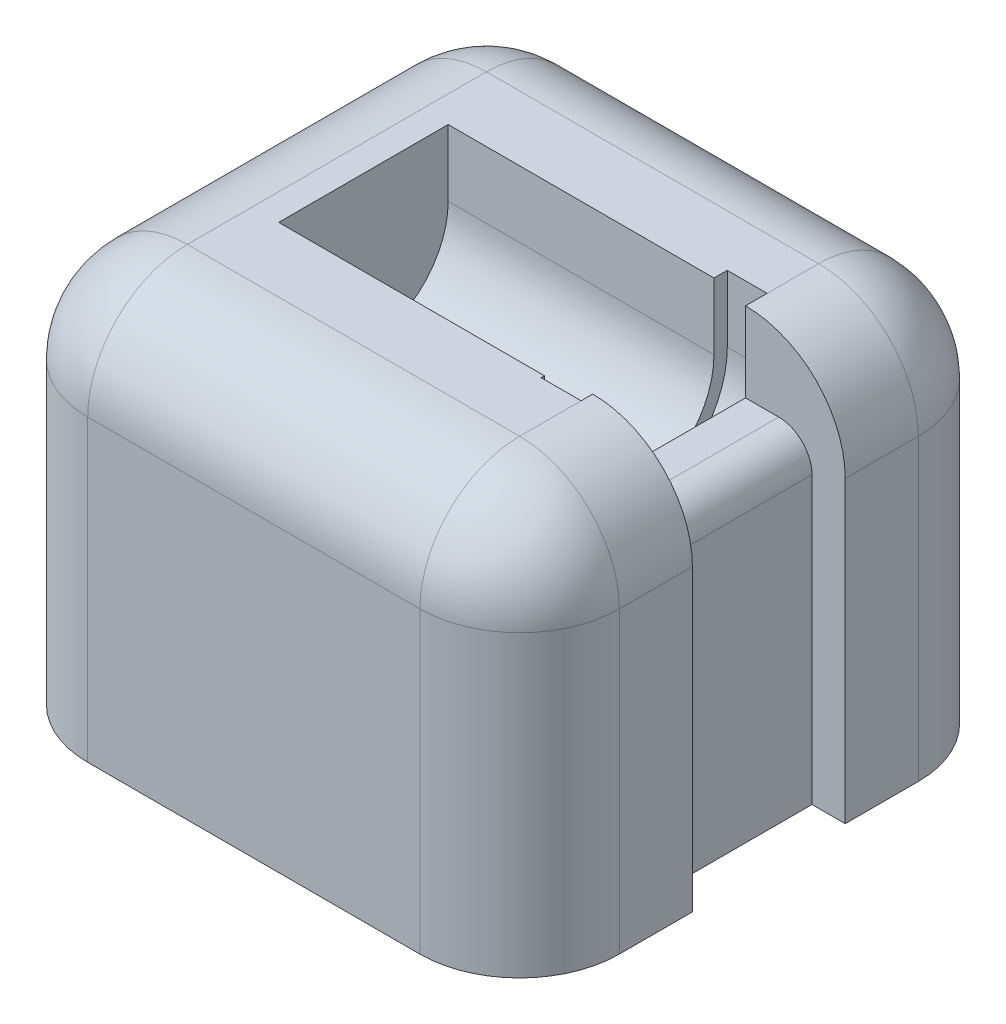
ISO-10303-21;
HEADER;
FILE_DESCRIPTION(('STEP AP214'),'2;1');
FILE_NAME('part.step','',(''),(''),'','','');
FILE_SCHEMA(('AUTOMOTIVE_DESIGN { 1 0 10303 214 1 1 1 1 }'));
ENDSEC;
DATA;
#1=APPLICATION_CONTEXT('core data for automotive mechanical design processes');
#2=APPLICATION_PROTOCOL_DEFINITION('international standard','automotive_design',2000,#1);
#3=PRODUCT_CONTEXT('',#1,'mechanical');
#4=PRODUCT('Part','Part','',(#3));
#5=PRODUCT_RELATED_PRODUCT_CATEGORY('part','',(#4));
#6=PRODUCT_DEFINITION_FORMATION('','',#4);
#7=PRODUCT_DEFINITION_CONTEXT('part definition',#1,'design');
#8=PRODUCT_DEFINITION('design','',#6,#7);
#9=PRODUCT_DEFINITION_SHAPE('','',#8);
#10=(LENGTH_UNIT() NAMED_UNIT(*) SI_UNIT(.MILLI.,.METRE.));
#11=(NAMED_UNIT(*) PLANE_ANGLE_UNIT() SI_UNIT($,.RADIAN.));
#12=(NAMED_UNIT(*) SI_UNIT($,.STERADIAN.) SOLID_ANGLE_UNIT());
#13=UNCERTAINTY_MEASURE_WITH_UNIT(LENGTH_MEASURE(1.E-05),#10,'distance_accuracy_value','');
#14=(GEOMETRIC_REPRESENTATION_CONTEXT(3) GLOBAL_UNCERTAINTY_ASSIGNED_CONTEXT((#13)) GLOBAL_UNIT_ASSIGNED_CONTEXT((#10,
#11,#12)) REPRESENTATION_CONTEXT('',''));
#15=CARTESIAN_POINT('',(0.,0.,0.));
#16=DIRECTION('',(0.,0.,1.));
#17=DIRECTION('',(1.,0.,0.));
#18=AXIS2_PLACEMENT_3D('',#15,#16,#17);
#19=CARTESIAN_POINT('',(7.5,12.,7.5));
#20=DIRECTION('',(-1.,0.,0.));
#21=DIRECTION('',(0.,0.,1.));
#22=AXIS2_PLACEMENT_3D('',#19,#20,#21);
#23=PLANE('',#22);
#24=DIRECTION('',(0.,-1.,0.));
#25=VECTOR('',#24,1.);
#26=CARTESIAN_POINT('',(7.5,12.,-2.3));
#27=LINE('',#26,#25);
#28=CARTESIAN_POINT('',(7.5,8.6,-2.3));
#29=VERTEX_POINT('',#28);
#30=CARTESIAN_POINT('',(7.5,0.,-2.3));
#31=VERTEX_POINT('',#30);
#32=EDGE_CURVE('E212',#29,#31,#27,.T.);
#33=ORIENTED_EDGE('',*,*,#32,.F.);
#34=DIRECTION('',(0.,0.,-1.));
#35=VECTOR('',#34,1.);
#36=CARTESIAN_POINT('',(7.5,8.6,7.5));
#37=LINE('',#36,#35);
#38=CARTESIAN_POINT('',(7.5,8.6,2.3));
#39=VERTEX_POINT('',#38);
#40=EDGE_CURVE('E329',#29,#39,#37,.F.);
#41=ORIENTED_EDGE('',*,*,#40,.T.);
#42=DIRECTION('',(0.,1.,0.));
#43=VECTOR('',#42,1.);
#44=CARTESIAN_POINT('',(7.5,0.,2.3));
#45=LINE('',#44,#43);
#46=CARTESIAN_POINT('',(7.5,0.,2.3));
#47=VERTEX_POINT('',#46);
#48=EDGE_CURVE('E221',#47,#39,#45,.T.);
#49=ORIENTED_EDGE('',*,*,#48,.F.);
#50=DIRECTION('',(0.,0.,-1.));
#51=VECTOR('',#50,1.);
#52=CARTESIAN_POINT('',(7.5,0.,7.5));
#53=LINE('',#52,#51);
#54=EDGE_CURVE('E321',#47,#31,#53,.T.);
#55=ORIENTED_EDGE('',*,*,#54,.T.);
#56=EDGE_LOOP('',(#33,#41,#49,#55));
#57=FACE_BOUND('',#56,.T.);
#58=ADVANCED_FACE('F35',(#57),#23,.F.);
#59=CARTESIAN_POINT('',(-7.5,12.,7.5));
#60=DIRECTION('',(1.,0.,0.));
#61=DIRECTION('',(0.,0.,-1.));
#62=AXIS2_PLACEMENT_3D('',#59,#60,#61);
#63=PLANE('',#62);
#64=DIRECTION('',(0.,0.,1.));
#65=VECTOR('',#64,1.);
#66=CARTESIAN_POINT('',(-7.5,9.,-7.5));
#67=LINE('',#66,#65);
#68=CARTESIAN_POINT('',(-7.5,9.,4.5));
#69=VERTEX_POINT('',#68);
#70=CARTESIAN_POINT('',(-7.5,9.,-4.5));
#71=VERTEX_POINT('',#70);
#72=EDGE_CURVE('E351',#69,#71,#67,.F.);
#73=ORIENTED_EDGE('',*,*,#72,.T.);
#74=DIRECTION('',(0.,-1.,0.));
#75=VECTOR('',#74,1.);
#76=CARTESIAN_POINT('',(-7.5,12.,-4.5));
#77=LINE('',#76,#75);
#78=CARTESIAN_POINT('',(-7.5,0.,-4.5));
#79=VERTEX_POINT('',#78);
#80=EDGE_CURVE('E353',#71,#79,#77,.T.);
#81=ORIENTED_EDGE('',*,*,#80,.T.);
#82=DIRECTION('',(0.,0.,1.));
#83=VECTOR('',#82,1.);
#84=CARTESIAN_POINT('',(-7.5,0.,7.5));
#85=LINE('',#84,#83);
#86=CARTESIAN_POINT('',(-7.5,0.,4.5));
#87=VERTEX_POINT('',#86);
#88=EDGE_CURVE('E313',#79,#87,#85,.T.);
#89=ORIENTED_EDGE('',*,*,#88,.T.);
#90=DIRECTION('',(0.,-1.,0.));
#91=VECTOR('',#90,1.);
#92=CARTESIAN_POINT('',(-7.5,12.,4.5));
#93=LINE('',#92,#91);
#94=EDGE_CURVE('E349',#87,#69,#93,.F.);
#95=ORIENTED_EDGE('',*,*,#94,.T.);
#96=EDGE_LOOP('',(#73,#81,#89,#95));
#97=FACE_BOUND('',#96,.T.);
#98=ADVANCED_FACE('F441',(#97),#63,.F.);
#99=CARTESIAN_POINT('',(7.5,12.,7.5));
#100=DIRECTION('',(0.,0.,-1.));
#101=DIRECTION('',(-1.,0.,0.));
#102=AXIS2_PLACEMENT_3D('',#99,#100,#101);
#103=PLANE('',#102);
#104=DIRECTION('',(1.,0.,0.));
#105=VECTOR('',#104,1.);
#106=CARTESIAN_POINT('',(-7.5,9.,7.5));
#107=LINE('',#106,#105);
#108=CARTESIAN_POINT('',(5.5,9.,7.5));
#109=VERTEX_POINT('',#108);
#110=CARTESIAN_POINT('',(-4.5,9.,7.5));
#111=VERTEX_POINT('',#110);
#112=EDGE_CURVE('E345',#109,#111,#107,.F.);
#113=ORIENTED_EDGE('',*,*,#112,.T.);
#114=DIRECTION('',(0.,-1.,0.));
#115=VECTOR('',#114,1.);
#116=CARTESIAN_POINT('',(-4.5,12.,7.5));
#117=LINE('',#116,#115);
#118=CARTESIAN_POINT('',(-4.5,0.,7.5));
#119=VERTEX_POINT('',#118);
#120=EDGE_CURVE('E347',#111,#119,#117,.T.);
#121=ORIENTED_EDGE('',*,*,#120,.T.);
#122=DIRECTION('',(1.,0.,0.));
#123=VECTOR('',#122,1.);
#124=CARTESIAN_POINT('',(7.5,0.,7.5));
#125=LINE('',#124,#123);
#126=CARTESIAN_POINT('',(5.5,0.,7.5));
#127=VERTEX_POINT('',#126);
#128=EDGE_CURVE('E318',#119,#127,#125,.T.);
#129=ORIENTED_EDGE('',*,*,#128,.T.);
#130=DIRECTION('',(0.,-1.,0.));
#131=VECTOR('',#130,1.);
#132=CARTESIAN_POINT('',(5.5,12.,7.5));
#133=LINE('',#132,#131);
#134=EDGE_CURVE('E342',#127,#109,#133,.F.);
#135=ORIENTED_EDGE('',*,*,#134,.T.);
#136=EDGE_LOOP('',(#113,#121,#129,#135));
#137=FACE_BOUND('',#136,.T.);
#138=ADVANCED_FACE('F447',(#137),#103,.F.);
#139=CARTESIAN_POINT('',(7.5,12.,-7.5));
#140=DIRECTION('',(0.,0.,1.));
#141=DIRECTION('',(1.,0.,0.));
#142=AXIS2_PLACEMENT_3D('',#139,#140,#141);
#143=PLANE('',#142);
#144=DIRECTION('',(-1.,0.,0.));
#145=VECTOR('',#144,1.);
#146=CARTESIAN_POINT('',(7.5,0.,-7.5));
#147=LINE('',#146,#145);
#148=CARTESIAN_POINT('',(5.5,0.,-7.5));
#149=VERTEX_POINT('',#148);
#150=CARTESIAN_POINT('',(-4.5,0.,-7.5));
#151=VERTEX_POINT('',#150);
#152=EDGE_CURVE('E323',#149,#151,#147,.T.);
#153=ORIENTED_EDGE('',*,*,#152,.T.);
#154=DIRECTION('',(0.,-1.,0.));
#155=VECTOR('',#154,1.);
#156=CARTESIAN_POINT('',(-4.5,12.,-7.5));
#157=LINE('',#156,#155);
#158=CARTESIAN_POINT('',(-4.5,9.,-7.5));
#159=VERTEX_POINT('',#158);
#160=EDGE_CURVE('E360',#151,#159,#157,.F.);
#161=ORIENTED_EDGE('',*,*,#160,.T.);
#162=DIRECTION('',(-1.,0.,0.));
#163=VECTOR('',#162,1.);
#164=CARTESIAN_POINT('',(8.5,9.,-7.5));
#165=LINE('',#164,#163);
#166=CARTESIAN_POINT('',(5.5,9.,-7.5));
#167=VERTEX_POINT('',#166);
#168=EDGE_CURVE('E357',#159,#167,#165,.F.);
#169=ORIENTED_EDGE('',*,*,#168,.T.);
#170=DIRECTION('',(0.,1.,0.));
#171=VECTOR('',#170,1.);
#172=CARTESIAN_POINT('',(5.5,0.,-7.5));
#173=LINE('',#172,#171);
#174=EDGE_CURVE('E355',#167,#149,#173,.F.);
#175=ORIENTED_EDGE('',*,*,#174,.T.);
#176=EDGE_LOOP('',(#153,#161,#169,#175));
#177=FACE_BOUND('',#176,.T.);
#178=ADVANCED_FACE('F424',(#177),#143,.F.);
#179=CARTESIAN_POINT('',(0.,12.,0.));
#180=DIRECTION('',(0.,1.,0.));
#181=DIRECTION('',(0.,0.,1.));
#182=AXIS2_PLACEMENT_3D('',#179,#180,#181);
#183=PLANE('',#182);
#184=DIRECTION('',(1.,0.,0.));
#185=VECTOR('',#184,1.);
#186=CARTESIAN_POINT('',(8.5,12.,4.5));
#187=LINE('',#186,#185);
#188=CARTESIAN_POINT('',(-4.5,12.,4.5));
#189=VERTEX_POINT('',#188);
#190=CARTESIAN_POINT('',(5.5,12.,4.5));
#191=VERTEX_POINT('',#190);
#192=EDGE_CURVE('E339',#189,#191,#187,.T.);
#193=ORIENTED_EDGE('',*,*,#192,.T.);
#194=DIRECTION('',(0.,0.,1.));
#195=VECTOR('',#194,1.);
#196=CARTESIAN_POINT('',(5.5,12.,0.));
#197=LINE('',#196,#195);
#198=CARTESIAN_POINT('',(5.5,12.,2.65));
#199=VERTEX_POINT('',#198);
#200=EDGE_CURVE('E396',#191,#199,#197,.F.);
#201=ORIENTED_EDGE('',*,*,#200,.T.);
#202=DIRECTION('',(1.,0.,0.));
#203=VECTOR('',#202,1.);
#204=CARTESIAN_POINT('',(4.3,12.,2.65));
#205=LINE('',#204,#203);
#206=CARTESIAN_POINT('',(4.3,12.,2.65));
#207=VERTEX_POINT('',#206);
#208=EDGE_CURVE('E293',#207,#199,#205,.T.);
#209=ORIENTED_EDGE('',*,*,#208,.F.);
#210=DIRECTION('',(0.,0.,1.));
#211=VECTOR('',#210,1.);
#212=CARTESIAN_POINT('',(4.3,12.,2.65));
#213=LINE('',#212,#211);
#214=CARTESIAN_POINT('',(4.3,12.,2.55));
#215=VERTEX_POINT('',#214);
#216=EDGE_CURVE('E279',#215,#207,#213,.T.);
#217=ORIENTED_EDGE('',*,*,#216,.F.);
#218=DIRECTION('',(1.,0.,0.));
#219=VECTOR('',#218,1.);
#220=CARTESIAN_POINT('',(-3.7,12.,2.55));
#221=LINE('',#220,#219);
#222=CARTESIAN_POINT('',(-3.7,12.,2.55));
#223=VERTEX_POINT('',#222);
#224=EDGE_CURVE('E263',#223,#215,#221,.T.);
#225=ORIENTED_EDGE('',*,*,#224,.F.);
#226=DIRECTION('',(0.,0.,1.));
#227=VECTOR('',#226,1.);
#228=CARTESIAN_POINT('',(-3.7,12.,2.55));
#229=LINE('',#228,#227);
#230=CARTESIAN_POINT('',(-3.7,12.,-2.55));
#231=VERTEX_POINT('',#230);
#232=EDGE_CURVE('E249',#231,#223,#229,.T.);
#233=ORIENTED_EDGE('',*,*,#232,.F.);
#234=DIRECTION('',(1.,0.,0.));
#235=VECTOR('',#234,1.);
#236=CARTESIAN_POINT('',(-3.7,12.,-2.55));
#237=LINE('',#236,#235);
#238=CARTESIAN_POINT('',(4.3,12.,-2.55));
#239=VERTEX_POINT('',#238);
#240=EDGE_CURVE('E265',#231,#239,#237,.T.);
#241=ORIENTED_EDGE('',*,*,#240,.T.);
#242=CARTESIAN_POINT('',(4.3,12.,-2.95));
#243=VERTEX_POINT('',#242);
#244=EDGE_CURVE('E280',#243,#239,#213,.T.);
#245=ORIENTED_EDGE('',*,*,#244,.F.);
#246=DIRECTION('',(1.,0.,0.));
#247=VECTOR('',#246,1.);
#248=CARTESIAN_POINT('',(4.3,12.,-2.95));
#249=LINE('',#248,#247);
#250=CARTESIAN_POINT('',(5.5,12.,-2.95));
#251=VERTEX_POINT('',#250);
#252=EDGE_CURVE('E297',#243,#251,#249,.T.);
#253=ORIENTED_EDGE('',*,*,#252,.T.);
#254=DIRECTION('',(0.,0.,1.));
#255=VECTOR('',#254,1.);
#256=CARTESIAN_POINT('',(5.5,12.,0.));
#257=LINE('',#256,#255);
#258=CARTESIAN_POINT('',(5.5,12.,-4.5));
#259=VERTEX_POINT('',#258);
#260=EDGE_CURVE('E394',#251,#259,#257,.F.);
#261=ORIENTED_EDGE('',*,*,#260,.T.);
#262=DIRECTION('',(-1.,0.,0.));
#263=VECTOR('',#262,1.);
#264=CARTESIAN_POINT('',(-7.5,12.,-4.5));
#265=LINE('',#264,#263);
#266=CARTESIAN_POINT('',(-4.5,12.,-4.5));
#267=VERTEX_POINT('',#266);
#268=EDGE_CURVE('E335',#259,#267,#265,.T.);
#269=ORIENTED_EDGE('',*,*,#268,.T.);
#270=DIRECTION('',(0.,0.,1.));
#271=VECTOR('',#270,1.);
#272=CARTESIAN_POINT('',(-4.5,12.,7.5));
#273=LINE('',#272,#271);
#274=EDGE_CURVE('E337',#267,#189,#273,.T.);
#275=ORIENTED_EDGE('',*,*,#274,.T.);
#276=EDGE_LOOP('',(#193,#201,#209,#217,#225,#233,#241,#245,#253,#261,#269,#275));
#277=FACE_BOUND('',#276,.T.);
#278=ADVANCED_FACE('F629',(#277),#183,.T.);
#279=CARTESIAN_POINT('',(0.,0.,0.));
#280=DIRECTION('',(0.,1.,0.));
#281=DIRECTION('',(0.,0.,1.));
#282=AXIS2_PLACEMENT_3D('',#279,#280,#281);
#283=PLANE('',#282);
#284=ORIENTED_EDGE('',*,*,#88,.F.);
#285=CARTESIAN_POINT('',(-4.5,0.,-4.5));
#286=DIRECTION('',(0.,1.,0.));
#287=DIRECTION('',(0.,0.,1.));
#288=AXIS2_PLACEMENT_3D('',#285,#286,#287);
#289=CIRCLE('',#288,3.);
#290=EDGE_CURVE('E367',#79,#151,#289,.F.);
#291=ORIENTED_EDGE('',*,*,#290,.T.);
#292=ORIENTED_EDGE('',*,*,#152,.F.);
#293=CARTESIAN_POINT('',(5.5,0.,-4.5));
#294=DIRECTION('',(0.,1.,0.));
#295=DIRECTION('',(0.,0.,1.));
#296=AXIS2_PLACEMENT_3D('',#293,#294,#295);
#297=CIRCLE('',#296,3.);
#298=CARTESIAN_POINT('',(8.5,0.,-4.5));
#299=VERTEX_POINT('',#298);
#300=EDGE_CURVE('E227',#149,#299,#297,.F.);
#301=ORIENTED_EDGE('',*,*,#300,.T.);
#302=DIRECTION('',(0.,0.,-1.));
#303=VECTOR('',#302,1.);
#304=CARTESIAN_POINT('',(8.5,0.,-2.3));
#305=LINE('',#304,#303);
#306=CARTESIAN_POINT('',(8.5,0.,-2.3));
#307=VERTEX_POINT('',#306);
#308=EDGE_CURVE('E209',#307,#299,#305,.T.);
#309=ORIENTED_EDGE('',*,*,#308,.F.);
#310=DIRECTION('',(-1.,0.,0.));
#311=VECTOR('',#310,1.);
#312=CARTESIAN_POINT('',(8.5,0.,-2.3));
#313=LINE('',#312,#311);
#314=EDGE_CURVE('E215',#307,#31,#313,.T.);
#315=ORIENTED_EDGE('',*,*,#314,.T.);
#316=ORIENTED_EDGE('',*,*,#54,.F.);
#317=DIRECTION('',(-1.,0.,0.));
#318=VECTOR('',#317,1.);
#319=CARTESIAN_POINT('',(8.5,0.,2.3));
#320=LINE('',#319,#318);
#321=CARTESIAN_POINT('',(8.5,0.,2.3));
#322=VERTEX_POINT('',#321);
#323=EDGE_CURVE('E237',#322,#47,#320,.T.);
#324=ORIENTED_EDGE('',*,*,#323,.F.);
#325=DIRECTION('',(0.,0.,-1.));
#326=VECTOR('',#325,1.);
#327=CARTESIAN_POINT('',(8.5,0.,7.5));
#328=LINE('',#327,#326);
#329=CARTESIAN_POINT('',(8.5,0.,4.5));
#330=VERTEX_POINT('',#329);
#331=EDGE_CURVE('E232',#330,#322,#328,.T.);
#332=ORIENTED_EDGE('',*,*,#331,.F.);
#333=CARTESIAN_POINT('',(5.5,0.,4.5));
#334=DIRECTION('',(0.,1.,0.));
#335=DIRECTION('',(0.,0.,1.));
#336=AXIS2_PLACEMENT_3D('',#333,#334,#335);
#337=CIRCLE('',#336,3.);
#338=EDGE_CURVE('E363',#330,#127,#337,.F.);
#339=ORIENTED_EDGE('',*,*,#338,.T.);
#340=ORIENTED_EDGE('',*,*,#128,.F.);
#341=CARTESIAN_POINT('',(-4.5,0.,4.5));
#342=DIRECTION('',(0.,1.,0.));
#343=DIRECTION('',(0.,0.,1.));
#344=AXIS2_PLACEMENT_3D('',#341,#342,#343);
#345=CIRCLE('',#344,3.);
#346=EDGE_CURVE('E365',#119,#87,#345,.F.);
#347=ORIENTED_EDGE('',*,*,#346,.T.);
#348=EDGE_LOOP('',(#284,#291,#292,#301,#309,#315,#316,#324,#332,#339,#340,#347));
#349=FACE_BOUND('',#348,.T.);
#350=ADVANCED_FACE('F224',(#349),#283,.F.);
#351=CARTESIAN_POINT('',(5.5,10.4,2.3));
#352=DIRECTION('',(0.,0.,1.));
#353=DIRECTION('',(1.,0.,0.));
#354=AXIS2_PLACEMENT_3D('',#351,#352,#353);
#355=PLANE('',#354);
#356=DIRECTION('',(0.,-1.,0.));
#357=VECTOR('',#356,1.);
#358=CARTESIAN_POINT('',(5.5,10.4,2.3));
#359=LINE('',#358,#357);
#360=CARTESIAN_POINT('',(5.5,12.,2.3));
#361=VERTEX_POINT('',#360);
#362=CARTESIAN_POINT('',(5.5,9.6,2.3));
#363=VERTEX_POINT('',#362);
#364=EDGE_CURVE('E296',#361,#363,#359,.T.);
#365=ORIENTED_EDGE('',*,*,#364,.F.);
#366=CARTESIAN_POINT('',(5.5,9.,2.3));
#367=DIRECTION('',(0.,0.,1.));
#368=DIRECTION('',(1.,0.,0.));
#369=AXIS2_PLACEMENT_3D('',#366,#367,#368);
#370=CIRCLE('',#369,3.);
#371=CARTESIAN_POINT('',(8.5,9.,2.3));
#372=VERTEX_POINT('',#371);
#373=EDGE_CURVE('E398',#361,#372,#370,.F.);
#374=ORIENTED_EDGE('',*,*,#373,.T.);
#375=DIRECTION('',(0.,1.,0.));
#376=VECTOR('',#375,1.);
#377=CARTESIAN_POINT('',(8.5,0.,2.3));
#378=LINE('',#377,#376);
#379=EDGE_CURVE('E234',#322,#372,#378,.T.);
#380=ORIENTED_EDGE('',*,*,#379,.F.);
#381=ORIENTED_EDGE('',*,*,#323,.T.);
#382=ORIENTED_EDGE('',*,*,#48,.T.);
#383=CARTESIAN_POINT('',(6.5,8.6,2.3));
#384=DIRECTION('',(0.,0.,1.));
#385=DIRECTION('',(1.,0.,0.));
#386=AXIS2_PLACEMENT_3D('',#383,#384,#385);
#387=CIRCLE('',#386,1.);
#388=CARTESIAN_POINT('',(6.5,9.6,2.3));
#389=VERTEX_POINT('',#388);
#390=EDGE_CURVE('E333',#39,#389,#387,.T.);
#391=ORIENTED_EDGE('',*,*,#390,.T.);
#392=DIRECTION('',(1.,0.,0.));
#393=VECTOR('',#392,1.);
#394=CARTESIAN_POINT('',(5.5,9.6,2.3));
#395=LINE('',#394,#393);
#396=EDGE_CURVE('E309',#363,#389,#395,.T.);
#397=ORIENTED_EDGE('',*,*,#396,.F.);
#398=EDGE_LOOP('',(#365,#374,#380,#381,#382,#391,#397));
#399=FACE_BOUND('',#398,.T.);
#400=ADVANCED_FACE('F604',(#399),#355,.F.);
#401=CARTESIAN_POINT('',(5.5,10.4,-2.3));
#402=DIRECTION('',(0.,0.,-1.));
#403=DIRECTION('',(0.,1.,0.));
#404=AXIS2_PLACEMENT_3D('',#401,#402,#403);
#405=PLANE('',#404);
#406=DIRECTION('',(0.,-1.,0.));
#407=VECTOR('',#406,1.);
#408=CARTESIAN_POINT('',(8.5,12.,-2.3));
#409=LINE('',#408,#407);
#410=CARTESIAN_POINT('',(8.5,9.,-2.3));
#411=VERTEX_POINT('',#410);
#412=EDGE_CURVE('E205',#411,#307,#409,.T.);
#413=ORIENTED_EDGE('',*,*,#412,.F.);
#414=CARTESIAN_POINT('',(5.5,9.,-2.3));
#415=DIRECTION('',(0.,0.,-1.));
#416=DIRECTION('',(0.,1.,0.));
#417=AXIS2_PLACEMENT_3D('',#414,#415,#416);
#418=CIRCLE('',#417,3.);
#419=CARTESIAN_POINT('',(5.5,12.,-2.3));
#420=VERTEX_POINT('',#419);
#421=EDGE_CURVE('E52',#411,#420,#418,.F.);
#422=ORIENTED_EDGE('',*,*,#421,.T.);
#423=DIRECTION('',(0.,1.,0.));
#424=VECTOR('',#423,1.);
#425=CARTESIAN_POINT('',(5.5,10.4,-2.3));
#426=LINE('',#425,#424);
#427=CARTESIAN_POINT('',(5.5,9.6,-2.3));
#428=VERTEX_POINT('',#427);
#429=EDGE_CURVE('E306',#428,#420,#426,.T.);
#430=ORIENTED_EDGE('',*,*,#429,.F.);
#431=DIRECTION('',(1.,0.,0.));
#432=VECTOR('',#431,1.);
#433=CARTESIAN_POINT('',(5.5,9.6,-2.3));
#434=LINE('',#433,#432);
#435=CARTESIAN_POINT('',(6.5,9.6,-2.3));
#436=VERTEX_POINT('',#435);
#437=EDGE_CURVE('E310',#428,#436,#434,.T.);
#438=ORIENTED_EDGE('',*,*,#437,.T.);
#439=CARTESIAN_POINT('',(6.5,8.6,-2.3));
#440=DIRECTION('',(0.,0.,-1.));
#441=DIRECTION('',(0.,1.,0.));
#442=AXIS2_PLACEMENT_3D('',#439,#440,#441);
#443=CIRCLE('',#442,1.);
#444=EDGE_CURVE('E331',#436,#29,#443,.T.);
#445=ORIENTED_EDGE('',*,*,#444,.T.);
#446=ORIENTED_EDGE('',*,*,#32,.T.);
#447=ORIENTED_EDGE('',*,*,#314,.F.);
#448=EDGE_LOOP('',(#413,#422,#430,#438,#445,#446,#447));
#449=FACE_BOUND('',#448,.T.);
#450=ADVANCED_FACE('F216',(#449),#405,.F.);
#451=CARTESIAN_POINT('',(5.5,9.6,-2.3));
#452=DIRECTION('',(0.,-1.,0.));
#453=DIRECTION('',(0.,0.,-1.));
#454=AXIS2_PLACEMENT_3D('',#451,#452,#453);
#455=PLANE('',#454);
#456=ORIENTED_EDGE('',*,*,#396,.T.);
#457=DIRECTION('',(0.,0.,-1.));
#458=VECTOR('',#457,1.);
#459=CARTESIAN_POINT('',(6.5,9.6,-2.3));
#460=LINE('',#459,#458);
#461=EDGE_CURVE('E326',#389,#436,#460,.T.);
#462=ORIENTED_EDGE('',*,*,#461,.T.);
#463=ORIENTED_EDGE('',*,*,#437,.F.);
#464=DIRECTION('',(0.,0.,-1.));
#465=VECTOR('',#464,1.);
#466=CARTESIAN_POINT('',(5.5,9.6,-2.3));
#467=LINE('',#466,#465);
#468=EDGE_CURVE('E304',#363,#428,#467,.T.);
#469=ORIENTED_EDGE('',*,*,#468,.F.);
#470=EDGE_LOOP('',(#456,#462,#463,#469));
#471=FACE_BOUND('',#470,.T.);
#472=ADVANCED_FACE('F603',(#471),#455,.F.);
#473=CARTESIAN_POINT('',(5.5,10.,0.));
#474=DIRECTION('',(1.,0.,0.));
#475=DIRECTION('',(0.,0.,-1.));
#476=AXIS2_PLACEMENT_3D('',#473,#474,#475);
#477=PLANE('',#476);
#478=ORIENTED_EDGE('',*,*,#468,.T.);
#479=ORIENTED_EDGE('',*,*,#429,.T.);
#480=DIRECTION('',(0.,0.,1.));
#481=VECTOR('',#480,1.);
#482=CARTESIAN_POINT('',(5.5,12.,2.65));
#483=LINE('',#482,#481);
#484=EDGE_CURVE('E273',#251,#420,#483,.T.);
#485=ORIENTED_EDGE('',*,*,#484,.F.);
#486=DIRECTION('',(0.,1.,0.));
#487=VECTOR('',#486,1.);
#488=CARTESIAN_POINT('',(5.5,12.,-2.95));
#489=LINE('',#488,#487);
#490=CARTESIAN_POINT('',(5.5,10.,-2.95));
#491=VERTEX_POINT('',#490);
#492=EDGE_CURVE('E289',#491,#251,#489,.T.);
#493=ORIENTED_EDGE('',*,*,#492,.F.);
#494=CARTESIAN_POINT('',(5.5,10.,0.));
#495=DIRECTION('',(1.,0.,0.));
#496=DIRECTION('',(0.,0.,-1.));
#497=AXIS2_PLACEMENT_3D('',#494,#495,#496);
#498=CIRCLE('',#497,2.95);
#499=CARTESIAN_POINT('',(5.5,8.70385186031842,2.65));
#500=VERTEX_POINT('',#499);
#501=EDGE_CURVE('E286',#500,#491,#498,.T.);
#502=ORIENTED_EDGE('',*,*,#501,.F.);
#503=DIRECTION('',(0.,-1.,0.));
#504=VECTOR('',#503,1.);
#505=CARTESIAN_POINT('',(5.5,11.2961481396816,2.65));
#506=LINE('',#505,#504);
#507=EDGE_CURVE('E262',#199,#500,#506,.T.);
#508=ORIENTED_EDGE('',*,*,#507,.F.);
#509=EDGE_CURVE('E291',#361,#199,#483,.T.);
#510=ORIENTED_EDGE('',*,*,#509,.F.);
#511=ORIENTED_EDGE('',*,*,#364,.T.);
#512=EDGE_LOOP('',(#478,#479,#485,#493,#502,#508,#510,#511));
#513=FACE_BOUND('',#512,.T.);
#514=ADVANCED_FACE('F741',(#513),#477,.F.);
#515=CARTESIAN_POINT('',(4.3,12.,-2.95));
#516=DIRECTION('',(0.,0.,-1.));
#517=DIRECTION('',(0.,1.,0.));
#518=AXIS2_PLACEMENT_3D('',#515,#516,#517);
#519=PLANE('',#518);
#520=ORIENTED_EDGE('',*,*,#492,.T.);
#521=ORIENTED_EDGE('',*,*,#252,.F.);
#522=DIRECTION('',(0.,1.,0.));
#523=VECTOR('',#522,1.);
#524=CARTESIAN_POINT('',(4.3,12.,-2.95));
#525=LINE('',#524,#523);
#526=CARTESIAN_POINT('',(4.3,10.,-2.95));
#527=VERTEX_POINT('',#526);
#528=EDGE_CURVE('E276',#527,#243,#525,.T.);
#529=ORIENTED_EDGE('',*,*,#528,.F.);
#530=DIRECTION('',(1.,0.,0.));
#531=VECTOR('',#530,1.);
#532=CARTESIAN_POINT('',(4.3,10.,-2.95));
#533=LINE('',#532,#531);
#534=EDGE_CURVE('E300',#527,#491,#533,.T.);
#535=ORIENTED_EDGE('',*,*,#534,.T.);
#536=EDGE_LOOP('',(#520,#521,#529,#535));
#537=FACE_BOUND('',#536,.T.);
#538=ADVANCED_FACE('F737',(#537),#519,.F.);
#539=CARTESIAN_POINT('',(4.3,10.,0.));
#540=DIRECTION('',(1.,0.,0.));
#541=DIRECTION('',(0.,0.,-1.));
#542=AXIS2_PLACEMENT_3D('',#539,#540,#541);
#543=CYLINDRICAL_SURFACE('',#542,2.95);
#544=ORIENTED_EDGE('',*,*,#501,.T.);
#545=ORIENTED_EDGE('',*,*,#534,.F.);
#546=CARTESIAN_POINT('',(4.3,10.,0.));
#547=DIRECTION('',(1.,0.,0.));
#548=DIRECTION('',(0.,0.,-1.));
#549=AXIS2_PLACEMENT_3D('',#546,#547,#548);
#550=CIRCLE('',#549,2.95);
#551=CARTESIAN_POINT('',(4.3,8.70385186031842,2.65));
#552=VERTEX_POINT('',#551);
#553=EDGE_CURVE('E272',#552,#527,#550,.T.);
#554=ORIENTED_EDGE('',*,*,#553,.F.);
#555=DIRECTION('',(1.,0.,0.));
#556=VECTOR('',#555,1.);
#557=CARTESIAN_POINT('',(4.3,8.70385186031842,2.65));
#558=LINE('',#557,#556);
#559=EDGE_CURVE('E283',#552,#500,#558,.T.);
#560=ORIENTED_EDGE('',*,*,#559,.T.);
#561=EDGE_LOOP('',(#544,#545,#554,#560));
#562=FACE_BOUND('',#561,.T.);
#563=ADVANCED_FACE('F727',(#562),#543,.F.);
#564=CARTESIAN_POINT('',(4.3,11.2961481396816,2.65));
#565=DIRECTION('',(0.,0.,1.));
#566=DIRECTION('',(1.,0.,0.));
#567=AXIS2_PLACEMENT_3D('',#564,#565,#566);
#568=PLANE('',#567);
#569=ORIENTED_EDGE('',*,*,#507,.T.);
#570=ORIENTED_EDGE('',*,*,#559,.F.);
#571=DIRECTION('',(0.,-1.,0.));
#572=VECTOR('',#571,1.);
#573=CARTESIAN_POINT('',(4.3,11.2961481396816,2.65));
#574=LINE('',#573,#572);
#575=EDGE_CURVE('E270',#207,#552,#574,.T.);
#576=ORIENTED_EDGE('',*,*,#575,.F.);
#577=ORIENTED_EDGE('',*,*,#208,.T.);
#578=EDGE_LOOP('',(#569,#570,#576,#577));
#579=FACE_BOUND('',#578,.T.);
#580=ADVANCED_FACE('F718',(#579),#568,.F.);
#581=CARTESIAN_POINT('',(4.3,10.,0.));
#582=DIRECTION('',(1.,0.,0.));
#583=DIRECTION('',(0.,0.,-1.));
#584=AXIS2_PLACEMENT_3D('',#581,#582,#583);
#585=PLANE('',#584);
#586=DIRECTION('',(0.,-1.,0.));
#587=VECTOR('',#586,1.);
#588=CARTESIAN_POINT('',(4.3,10.,2.55));
#589=LINE('',#588,#587);
#590=CARTESIAN_POINT('',(4.3,10.,2.55));
#591=VERTEX_POINT('',#590);
#592=EDGE_CURVE('E246',#215,#591,#589,.T.);
#593=ORIENTED_EDGE('',*,*,#592,.F.);
#594=ORIENTED_EDGE('',*,*,#216,.T.);
#595=ORIENTED_EDGE('',*,*,#575,.T.);
#596=ORIENTED_EDGE('',*,*,#553,.T.);
#597=ORIENTED_EDGE('',*,*,#528,.T.);
#598=ORIENTED_EDGE('',*,*,#244,.T.);
#599=DIRECTION('',(0.,1.,0.));
#600=VECTOR('',#599,1.);
#601=CARTESIAN_POINT('',(4.3,12.,-2.55));
#602=LINE('',#601,#600);
#603=CARTESIAN_POINT('',(4.3,10.,-2.55));
#604=VERTEX_POINT('',#603);
#605=EDGE_CURVE('E256',#604,#239,#602,.T.);
#606=ORIENTED_EDGE('',*,*,#605,.F.);
#607=CARTESIAN_POINT('',(4.3,10.,0.));
#608=DIRECTION('',(1.,0.,0.));
#609=DIRECTION('',(0.,0.,-1.));
#610=AXIS2_PLACEMENT_3D('',#607,#608,#609);
#611=CIRCLE('',#610,2.55);
#612=EDGE_CURVE('E241',#591,#604,#611,.T.);
#613=ORIENTED_EDGE('',*,*,#612,.F.);
#614=EDGE_LOOP('',(#593,#594,#595,#596,#597,#598,#606,#613));
#615=FACE_BOUND('',#614,.T.);
#616=ADVANCED_FACE('F709',(#615),#585,.T.);
#617=CARTESIAN_POINT('',(-3.7,10.,0.));
#618=DIRECTION('',(1.,0.,0.));
#619=DIRECTION('',(0.,0.,-1.));
#620=AXIS2_PLACEMENT_3D('',#617,#618,#619);
#621=CYLINDRICAL_SURFACE('',#620,2.55);
#622=ORIENTED_EDGE('',*,*,#612,.T.);
#623=DIRECTION('',(1.,0.,0.));
#624=VECTOR('',#623,1.);
#625=CARTESIAN_POINT('',(-3.7,10.,-2.55));
#626=LINE('',#625,#624);
#627=CARTESIAN_POINT('',(-3.7,10.,-2.55));
#628=VERTEX_POINT('',#627);
#629=EDGE_CURVE('E254',#628,#604,#626,.T.);
#630=ORIENTED_EDGE('',*,*,#629,.F.);
#631=CARTESIAN_POINT('',(-3.7,10.,0.));
#632=DIRECTION('',(1.,0.,0.));
#633=DIRECTION('',(0.,0.,-1.));
#634=AXIS2_PLACEMENT_3D('',#631,#632,#633);
#635=CIRCLE('',#634,2.55);
#636=CARTESIAN_POINT('',(-3.7,10.,2.55));
#637=VERTEX_POINT('',#636);
#638=EDGE_CURVE('E242',#637,#628,#635,.T.);
#639=ORIENTED_EDGE('',*,*,#638,.F.);
#640=DIRECTION('',(1.,0.,0.));
#641=VECTOR('',#640,1.);
#642=CARTESIAN_POINT('',(-3.7,10.,2.55));
#643=LINE('',#642,#641);
#644=EDGE_CURVE('E260',#637,#591,#643,.T.);
#645=ORIENTED_EDGE('',*,*,#644,.T.);
#646=EDGE_LOOP('',(#622,#630,#639,#645));
#647=FACE_BOUND('',#646,.T.);
#648=ADVANCED_FACE('F700',(#647),#621,.F.);
#649=CARTESIAN_POINT('',(-3.7,10.,2.55));
#650=DIRECTION('',(0.,0.,1.));
#651=DIRECTION('',(0.,-1.,0.));
#652=AXIS2_PLACEMENT_3D('',#649,#650,#651);
#653=PLANE('',#652);
#654=ORIENTED_EDGE('',*,*,#592,.T.);
#655=ORIENTED_EDGE('',*,*,#644,.F.);
#656=DIRECTION('',(0.,-1.,0.));
#657=VECTOR('',#656,1.);
#658=CARTESIAN_POINT('',(-3.7,10.,2.55));
#659=LINE('',#658,#657);
#660=EDGE_CURVE('E251',#223,#637,#659,.T.);
#661=ORIENTED_EDGE('',*,*,#660,.F.);
#662=ORIENTED_EDGE('',*,*,#224,.T.);
#663=EDGE_LOOP('',(#654,#655,#661,#662));
#664=FACE_BOUND('',#663,.T.);
#665=ADVANCED_FACE('F691',(#664),#653,.F.);
#666=CARTESIAN_POINT('',(-3.7,12.,-2.55));
#667=DIRECTION('',(0.,0.,-1.));
#668=DIRECTION('',(-1.,0.,0.));
#669=AXIS2_PLACEMENT_3D('',#666,#667,#668);
#670=PLANE('',#669);
#671=ORIENTED_EDGE('',*,*,#605,.T.);
#672=ORIENTED_EDGE('',*,*,#240,.F.);
#673=DIRECTION('',(0.,1.,0.));
#674=VECTOR('',#673,1.);
#675=CARTESIAN_POINT('',(-3.7,12.,-2.55));
#676=LINE('',#675,#674);
#677=EDGE_CURVE('E245',#628,#231,#676,.T.);
#678=ORIENTED_EDGE('',*,*,#677,.F.);
#679=ORIENTED_EDGE('',*,*,#629,.T.);
#680=EDGE_LOOP('',(#671,#672,#678,#679));
#681=FACE_BOUND('',#680,.T.);
#682=ADVANCED_FACE('F682',(#681),#670,.F.);
#683=CARTESIAN_POINT('',(-3.7,10.,0.));
#684=DIRECTION('',(1.,0.,0.));
#685=DIRECTION('',(0.,0.,-1.));
#686=AXIS2_PLACEMENT_3D('',#683,#684,#685);
#687=PLANE('',#686);
#688=ORIENTED_EDGE('',*,*,#638,.T.);
#689=ORIENTED_EDGE('',*,*,#677,.T.);
#690=ORIENTED_EDGE('',*,*,#232,.T.);
#691=ORIENTED_EDGE('',*,*,#660,.T.);
#692=EDGE_LOOP('',(#688,#689,#690,#691));
#693=FACE_BOUND('',#692,.T.);
#694=ADVANCED_FACE('F592',(#693),#687,.T.);
#695=CARTESIAN_POINT('',(8.5,0.,0.));
#696=DIRECTION('',(1.,0.,0.));
#697=DIRECTION('',(0.,0.,-1.));
#698=AXIS2_PLACEMENT_3D('',#695,#696,#697);
#699=PLANE('',#698);
#700=ORIENTED_EDGE('',*,*,#379,.T.);
#701=DIRECTION('',(0.,0.,1.));
#702=VECTOR('',#701,1.);
#703=CARTESIAN_POINT('',(8.5,9.,0.));
#704=LINE('',#703,#702);
#705=CARTESIAN_POINT('',(8.5,9.,4.5));
#706=VERTEX_POINT('',#705);
#707=EDGE_CURVE('E373',#372,#706,#704,.T.);
#708=ORIENTED_EDGE('',*,*,#707,.T.);
#709=DIRECTION('',(0.,-1.,0.));
#710=VECTOR('',#709,1.);
#711=CARTESIAN_POINT('',(8.5,0.,4.5));
#712=LINE('',#711,#710);
#713=EDGE_CURVE('E369',#706,#330,#712,.T.);
#714=ORIENTED_EDGE('',*,*,#713,.T.);
#715=ORIENTED_EDGE('',*,*,#331,.T.);
#716=EDGE_LOOP('',(#700,#708,#714,#715));
#717=FACE_BOUND('',#716,.T.);
#718=ADVANCED_FACE('F584',(#717),#699,.T.);
#719=CARTESIAN_POINT('',(8.5,0.,0.));
#720=DIRECTION('',(1.,0.,0.));
#721=DIRECTION('',(0.,0.,-1.));
#722=AXIS2_PLACEMENT_3D('',#719,#720,#721);
#723=PLANE('',#722);
#724=DIRECTION('',(0.,1.,0.));
#725=VECTOR('',#724,1.);
#726=CARTESIAN_POINT('',(8.5,12.,-4.5));
#727=LINE('',#726,#725);
#728=CARTESIAN_POINT('',(8.5,9.,-4.5));
#729=VERTEX_POINT('',#728);
#730=EDGE_CURVE('E371',#299,#729,#727,.T.);
#731=ORIENTED_EDGE('',*,*,#730,.T.);
#732=DIRECTION('',(0.,0.,1.));
#733=VECTOR('',#732,1.);
#734=CARTESIAN_POINT('',(8.5,9.,0.));
#735=LINE('',#734,#733);
#736=EDGE_CURVE('E210',#729,#411,#735,.T.);
#737=ORIENTED_EDGE('',*,*,#736,.T.);
#738=ORIENTED_EDGE('',*,*,#412,.T.);
#739=ORIENTED_EDGE('',*,*,#308,.T.);
#740=EDGE_LOOP('',(#731,#737,#738,#739));
#741=FACE_BOUND('',#740,.T.);
#742=ADVANCED_FACE('F207',(#741),#723,.T.);
#743=CARTESIAN_POINT('',(6.5,8.6,-2.3));
#744=DIRECTION('',(0.,0.,-1.));
#745=DIRECTION('',(-1.,0.,0.));
#746=AXIS2_PLACEMENT_3D('',#743,#744,#745);
#747=CYLINDRICAL_SURFACE('',#746,1.);
#748=ORIENTED_EDGE('',*,*,#390,.F.);
#749=ORIENTED_EDGE('',*,*,#40,.F.);
#750=ORIENTED_EDGE('',*,*,#444,.F.);
#751=ORIENTED_EDGE('',*,*,#461,.F.);
#752=EDGE_LOOP('',(#748,#749,#750,#751));
#753=FACE_BOUND('',#752,.T.);
#754=ADVANCED_FACE('F429',(#753),#747,.T.);
#755=CARTESIAN_POINT('',(5.5,0.,-4.5));
#756=DIRECTION('',(0.,-1.,0.));
#757=DIRECTION('',(0.,0.,-1.));
#758=AXIS2_PLACEMENT_3D('',#755,#756,#757);
#759=CYLINDRICAL_SURFACE('',#758,3.);
#760=ORIENTED_EDGE('',*,*,#174,.F.);
#761=CARTESIAN_POINT('',(5.5,9.,-4.5));
#762=DIRECTION('',(0.,-1.,0.));
#763=DIRECTION('',(0.,0.,-1.));
#764=AXIS2_PLACEMENT_3D('',#761,#762,#763);
#765=CIRCLE('',#764,3.);
#766=EDGE_CURVE('E11',#167,#729,#765,.T.);
#767=ORIENTED_EDGE('',*,*,#766,.T.);
#768=ORIENTED_EDGE('',*,*,#730,.F.);
#769=ORIENTED_EDGE('',*,*,#300,.F.);
#770=EDGE_LOOP('',(#760,#767,#768,#769));
#771=FACE_BOUND('',#770,.T.);
#772=ADVANCED_FACE('F426',(#771),#759,.T.);
#773=CARTESIAN_POINT('',(-4.5,12.,-4.5));
#774=DIRECTION('',(0.,-1.,0.));
#775=DIRECTION('',(0.,0.,-1.));
#776=AXIS2_PLACEMENT_3D('',#773,#774,#775);
#777=CYLINDRICAL_SURFACE('',#776,3.);
#778=ORIENTED_EDGE('',*,*,#290,.F.);
#779=ORIENTED_EDGE('',*,*,#80,.F.);
#780=CARTESIAN_POINT('',(-4.5,9.,-4.5));
#781=DIRECTION('',(0.,1.,0.));
#782=DIRECTION('',(0.,0.,1.));
#783=AXIS2_PLACEMENT_3D('',#780,#781,#782);
#784=CIRCLE('',#783,3.);
#785=EDGE_CURVE('E230',#159,#71,#784,.T.);
#786=ORIENTED_EDGE('',*,*,#785,.F.);
#787=ORIENTED_EDGE('',*,*,#160,.F.);
#788=EDGE_LOOP('',(#778,#779,#786,#787));
#789=FACE_BOUND('',#788,.T.);
#790=ADVANCED_FACE('F428',(#789),#777,.T.);
#791=CARTESIAN_POINT('',(0.,9.,-4.5));
#792=DIRECTION('',(1.,0.,0.));
#793=DIRECTION('',(0.,0.,-1.));
#794=AXIS2_PLACEMENT_3D('',#791,#792,#793);
#795=CYLINDRICAL_SURFACE('',#794,3.);
#796=ORIENTED_EDGE('',*,*,#268,.F.);
#797=CARTESIAN_POINT('',(5.5,9.,-4.5));
#798=DIRECTION('',(1.,0.,0.));
#799=DIRECTION('',(0.,0.,-1.));
#800=AXIS2_PLACEMENT_3D('',#797,#798,#799);
#801=CIRCLE('',#800,3.);
#802=EDGE_CURVE('E44',#259,#167,#801,.F.);
#803=ORIENTED_EDGE('',*,*,#802,.T.);
#804=ORIENTED_EDGE('',*,*,#168,.F.);
#805=CARTESIAN_POINT('',(-4.5,9.,-4.5));
#806=DIRECTION('',(-1.,0.,0.));
#807=DIRECTION('',(0.,0.,1.));
#808=AXIS2_PLACEMENT_3D('',#805,#806,#807);
#809=CIRCLE('',#808,3.);
#810=EDGE_CURVE('E387',#267,#159,#809,.T.);
#811=ORIENTED_EDGE('',*,*,#810,.F.);
#812=EDGE_LOOP('',(#796,#803,#804,#811));
#813=FACE_BOUND('',#812,.T.);
#814=ADVANCED_FACE('F420',(#813),#795,.T.);
#815=CARTESIAN_POINT('',(-4.5,9.,-4.5));
#816=DIRECTION('',(0.,0.,1.));
#817=DIRECTION('',(1.,0.,0.));
#818=AXIS2_PLACEMENT_3D('',#815,#816,#817);
#819=SPHERICAL_SURFACE('',#818,3.);
#820=ORIENTED_EDGE('',*,*,#810,.T.);
#821=ORIENTED_EDGE('',*,*,#785,.T.);
#822=CARTESIAN_POINT('',(-4.5,9.,-4.5));
#823=DIRECTION('',(0.,0.,-1.));
#824=DIRECTION('',(0.,1.,0.));
#825=AXIS2_PLACEMENT_3D('',#822,#823,#824);
#826=CIRCLE('',#825,3.);
#827=EDGE_CURVE('E384',#267,#71,#826,.F.);
#828=ORIENTED_EDGE('',*,*,#827,.F.);
#829=EDGE_LOOP('',(#820,#821,#828));
#830=FACE_BOUND('',#829,.T.);
#831=ADVANCED_FACE('F476',(#830),#819,.T.);
#832=CARTESIAN_POINT('',(-4.5,12.,4.5));
#833=DIRECTION('',(0.,-1.,0.));
#834=DIRECTION('',(0.,0.,-1.));
#835=AXIS2_PLACEMENT_3D('',#832,#833,#834);
#836=CYLINDRICAL_SURFACE('',#835,3.);
#837=ORIENTED_EDGE('',*,*,#346,.F.);
#838=ORIENTED_EDGE('',*,*,#120,.F.);
#839=CARTESIAN_POINT('',(-4.5,9.,4.5));
#840=DIRECTION('',(0.,1.,0.));
#841=DIRECTION('',(0.,0.,1.));
#842=AXIS2_PLACEMENT_3D('',#839,#840,#841);
#843=CIRCLE('',#842,3.);
#844=EDGE_CURVE('E381',#69,#111,#843,.T.);
#845=ORIENTED_EDGE('',*,*,#844,.F.);
#846=ORIENTED_EDGE('',*,*,#94,.F.);
#847=EDGE_LOOP('',(#837,#838,#845,#846));
#848=FACE_BOUND('',#847,.T.);
#849=ADVANCED_FACE('F472',(#848),#836,.T.);
#850=CARTESIAN_POINT('',(-4.5,9.,0.));
#851=DIRECTION('',(0.,0.,-1.));
#852=DIRECTION('',(-1.,0.,0.));
#853=AXIS2_PLACEMENT_3D('',#850,#851,#852);
#854=CYLINDRICAL_SURFACE('',#853,3.);
#855=ORIENTED_EDGE('',*,*,#827,.T.);
#856=ORIENTED_EDGE('',*,*,#72,.F.);
#857=CARTESIAN_POINT('',(-4.5,9.,4.5));
#858=DIRECTION('',(0.,0.,1.));
#859=DIRECTION('',(1.,0.,0.));
#860=AXIS2_PLACEMENT_3D('',#857,#858,#859);
#861=CIRCLE('',#860,3.);
#862=EDGE_CURVE('E377',#189,#69,#861,.T.);
#863=ORIENTED_EDGE('',*,*,#862,.F.);
#864=ORIENTED_EDGE('',*,*,#274,.F.);
#865=EDGE_LOOP('',(#855,#856,#863,#864));
#866=FACE_BOUND('',#865,.T.);
#867=ADVANCED_FACE('F468',(#866),#854,.T.);
#868=CARTESIAN_POINT('',(-4.5,9.,4.5));
#869=DIRECTION('',(0.,0.,1.));
#870=DIRECTION('',(1.,0.,0.));
#871=AXIS2_PLACEMENT_3D('',#868,#869,#870);
#872=SPHERICAL_SURFACE('',#871,3.);
#873=ORIENTED_EDGE('',*,*,#862,.T.);
#874=ORIENTED_EDGE('',*,*,#844,.T.);
#875=CARTESIAN_POINT('',(-4.5,9.,4.5));
#876=DIRECTION('',(-1.,0.,0.));
#877=DIRECTION('',(0.,-1.,0.));
#878=AXIS2_PLACEMENT_3D('',#875,#876,#877);
#879=CIRCLE('',#878,3.);
#880=EDGE_CURVE('E374',#189,#111,#879,.F.);
#881=ORIENTED_EDGE('',*,*,#880,.F.);
#882=EDGE_LOOP('',(#873,#874,#881));
#883=FACE_BOUND('',#882,.T.);
#884=ADVANCED_FACE('F464',(#883),#872,.T.);
#885=CARTESIAN_POINT('',(5.5,0.,4.5));
#886=DIRECTION('',(0.,1.,0.));
#887=DIRECTION('',(0.,0.,1.));
#888=AXIS2_PLACEMENT_3D('',#885,#886,#887);
#889=CYLINDRICAL_SURFACE('',#888,3.);
#890=ORIENTED_EDGE('',*,*,#713,.F.);
#891=CARTESIAN_POINT('',(5.5,9.,4.5));
#892=DIRECTION('',(0.,1.,0.));
#893=DIRECTION('',(0.,0.,1.));
#894=AXIS2_PLACEMENT_3D('',#891,#892,#893);
#895=CIRCLE('',#894,3.);
#896=EDGE_CURVE('E404',#706,#109,#895,.F.);
#897=ORIENTED_EDGE('',*,*,#896,.T.);
#898=ORIENTED_EDGE('',*,*,#134,.F.);
#899=ORIENTED_EDGE('',*,*,#338,.F.);
#900=EDGE_LOOP('',(#890,#897,#898,#899));
#901=FACE_BOUND('',#900,.T.);
#902=ADVANCED_FACE('F460',(#901),#889,.T.);
#903=CARTESIAN_POINT('',(0.,9.,4.5));
#904=DIRECTION('',(-1.,0.,0.));
#905=DIRECTION('',(0.,0.,1.));
#906=AXIS2_PLACEMENT_3D('',#903,#904,#905);
#907=CYLINDRICAL_SURFACE('',#906,3.);
#908=ORIENTED_EDGE('',*,*,#112,.F.);
#909=CARTESIAN_POINT('',(5.5,9.,4.5));
#910=DIRECTION('',(-1.,0.,0.));
#911=DIRECTION('',(0.,0.,1.));
#912=AXIS2_PLACEMENT_3D('',#909,#910,#911);
#913=CIRCLE('',#912,3.);
#914=EDGE_CURVE('E402',#109,#191,#913,.T.);
#915=ORIENTED_EDGE('',*,*,#914,.T.);
#916=ORIENTED_EDGE('',*,*,#192,.F.);
#917=ORIENTED_EDGE('',*,*,#880,.T.);
#918=EDGE_LOOP('',(#908,#915,#916,#917));
#919=FACE_BOUND('',#918,.T.);
#920=ADVANCED_FACE('F456',(#919),#907,.T.);
#921=CARTESIAN_POINT('',(5.5,9.,4.5));
#922=DIRECTION('',(0.,0.,1.));
#923=DIRECTION('',(1.,0.,0.));
#924=AXIS2_PLACEMENT_3D('',#921,#922,#923);
#925=SPHERICAL_SURFACE('',#924,3.);
#926=ORIENTED_EDGE('',*,*,#914,.F.);
#927=ORIENTED_EDGE('',*,*,#896,.F.);
#928=CARTESIAN_POINT('',(5.5,9.,4.5));
#929=DIRECTION('',(0.,0.,-1.));
#930=DIRECTION('',(-1.,0.,0.));
#931=AXIS2_PLACEMENT_3D('',#928,#929,#930);
#932=CIRCLE('',#931,3.);
#933=EDGE_CURVE('E378',#191,#706,#932,.T.);
#934=ORIENTED_EDGE('',*,*,#933,.F.);
#935=EDGE_LOOP('',(#926,#927,#934));
#936=FACE_BOUND('',#935,.T.);
#937=ADVANCED_FACE('F459',(#936),#925,.T.);
#938=CARTESIAN_POINT('',(5.5,9.,0.));
#939=DIRECTION('',(0.,0.,1.));
#940=DIRECTION('',(1.,0.,0.));
#941=AXIS2_PLACEMENT_3D('',#938,#939,#940);
#942=CYLINDRICAL_SURFACE('',#941,3.);
#943=ORIENTED_EDGE('',*,*,#509,.T.);
#944=ORIENTED_EDGE('',*,*,#200,.F.);
#945=ORIENTED_EDGE('',*,*,#933,.T.);
#946=ORIENTED_EDGE('',*,*,#707,.F.);
#947=ORIENTED_EDGE('',*,*,#373,.F.);
#948=EDGE_LOOP('',(#943,#944,#945,#946,#947));
#949=FACE_BOUND('',#948,.T.);
#950=ADVANCED_FACE('F517',(#949),#942,.T.);
#951=CARTESIAN_POINT('',(5.5,9.,-4.5));
#952=DIRECTION('',(0.,0.,1.));
#953=DIRECTION('',(1.,0.,0.));
#954=AXIS2_PLACEMENT_3D('',#951,#952,#953);
#955=SPHERICAL_SURFACE('',#954,3.);
#956=ORIENTED_EDGE('',*,*,#766,.F.);
#957=ORIENTED_EDGE('',*,*,#802,.F.);
#958=CARTESIAN_POINT('',(5.5,9.,-4.5));
#959=DIRECTION('',(0.,0.,1.));
#960=DIRECTION('',(1.,0.,0.));
#961=AXIS2_PLACEMENT_3D('',#958,#959,#960);
#962=CIRCLE('',#961,3.);
#963=EDGE_CURVE('E39',#729,#259,#962,.T.);
#964=ORIENTED_EDGE('',*,*,#963,.F.);
#965=EDGE_LOOP('',(#956,#957,#964));
#966=FACE_BOUND('',#965,.T.);
#967=ADVANCED_FACE('F37',(#966),#955,.T.);
#968=CARTESIAN_POINT('',(5.5,9.,0.));
#969=DIRECTION('',(0.,0.,1.));
#970=DIRECTION('',(1.,0.,0.));
#971=AXIS2_PLACEMENT_3D('',#968,#969,#970);
#972=CYLINDRICAL_SURFACE('',#971,3.);
#973=ORIENTED_EDGE('',*,*,#260,.F.);
#974=ORIENTED_EDGE('',*,*,#484,.T.);
#975=ORIENTED_EDGE('',*,*,#421,.F.);
#976=ORIENTED_EDGE('',*,*,#736,.F.);
#977=ORIENTED_EDGE('',*,*,#963,.T.);
#978=EDGE_LOOP('',(#973,#974,#975,#976,#977));
#979=FACE_BOUND('',#978,.T.);
#980=ADVANCED_FACE('F414',(#979),#972,.T.);
#981=CLOSED_SHELL('',(#58,#98,#138,#178,#278,#350,#400,#450,#472,#514,#538,#563,#580,#616,#648,
#665,#682,#694,#718,#742,#754,#772,#790,#814,#831,#849,#867,#884,#902,#920,#937,#950,#967,#980));
#982=MANIFOLD_SOLID_BREP('B2',#981);
#983=ADVANCED_BREP_SHAPE_REPRESENTATION('',(#18,#982),#14);
#984=SHAPE_DEFINITION_REPRESENTATION(#9,#983);
ENDSEC;
END-ISO-10303-21;
